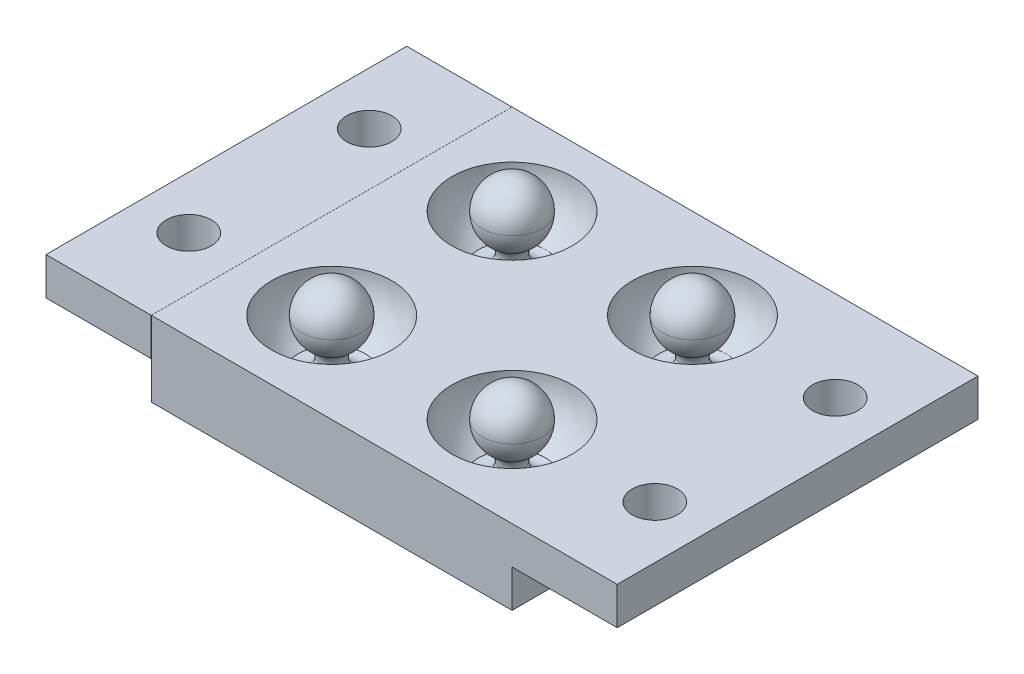
ISO-10303-21;
HEADER;
FILE_DESCRIPTION(('STEP AP214'),'2;1');
FILE_NAME('part.step','',(''),(''),'','','');
FILE_SCHEMA(('AUTOMOTIVE_DESIGN { 1 0 10303 214 1 1 1 1 }'));
ENDSEC;
DATA;
#1=APPLICATION_CONTEXT('core data for automotive mechanical design processes');
#2=APPLICATION_PROTOCOL_DEFINITION('international standard','automotive_design',2000,#1);
#3=PRODUCT_CONTEXT('',#1,'mechanical');
#4=PRODUCT('Part','Part','',(#3));
#5=PRODUCT_RELATED_PRODUCT_CATEGORY('part','',(#4));
#6=PRODUCT_DEFINITION_FORMATION('','',#4);
#7=PRODUCT_DEFINITION_CONTEXT('part definition',#1,'design');
#8=PRODUCT_DEFINITION('design','',#6,#7);
#9=PRODUCT_DEFINITION_SHAPE('','',#8);
#10=(LENGTH_UNIT() NAMED_UNIT(*) SI_UNIT(.MILLI.,.METRE.));
#11=(NAMED_UNIT(*) PLANE_ANGLE_UNIT() SI_UNIT($,.RADIAN.));
#12=(NAMED_UNIT(*) SI_UNIT($,.STERADIAN.) SOLID_ANGLE_UNIT());
#13=UNCERTAINTY_MEASURE_WITH_UNIT(LENGTH_MEASURE(1.E-05),#10,'distance_accuracy_value','');
#14=(GEOMETRIC_REPRESENTATION_CONTEXT(3) GLOBAL_UNCERTAINTY_ASSIGNED_CONTEXT((#13)) GLOBAL_UNIT_ASSIGNED_CONTEXT((#10,
#11,#12)) REPRESENTATION_CONTEXT('',''));
#15=CARTESIAN_POINT('',(0.,0.,0.));
#16=DIRECTION('',(0.,0.,1.));
#17=DIRECTION('',(1.,0.,0.));
#18=AXIS2_PLACEMENT_3D('',#15,#16,#17);
#19=CARTESIAN_POINT('',(-6.50216281890004,-1.25,0.));
#20=DIRECTION('',(1.,0.,0.));
#21=DIRECTION('',(0.,0.,-1.));
#22=AXIS2_PLACEMENT_3D('',#19,#20,#21);
#23=PLANE('',#22);
#24=DIRECTION('',(0.,0.,-1.));
#25=VECTOR('',#24,1.);
#26=CARTESIAN_POINT('',(-6.50216281890004,0.,0.));
#27=LINE('',#26,#25);
#28=CARTESIAN_POINT('',(-6.50216281890004,0.,9.00000000000001));
#29=VERTEX_POINT('',#28);
#30=CARTESIAN_POINT('',(-6.50216281890004,0.,-3.));
#31=VERTEX_POINT('',#30);
#32=EDGE_CURVE('E126',#29,#31,#27,.T.);
#33=ORIENTED_EDGE('',*,*,#32,.T.);
#34=DIRECTION('',(0.,1.,0.));
#35=VECTOR('',#34,1.);
#36=CARTESIAN_POINT('',(-6.50216281890004,-1.25,-3.));
#37=LINE('',#36,#35);
#38=CARTESIAN_POINT('',(-6.50216281890004,-1.25,-3.));
#39=VERTEX_POINT('',#38);
#40=EDGE_CURVE('E12',#39,#31,#37,.T.);
#41=ORIENTED_EDGE('',*,*,#40,.F.);
#42=DIRECTION('',(0.,0.,-1.));
#43=VECTOR('',#42,1.);
#44=CARTESIAN_POINT('',(-6.50216281890004,-1.25,0.));
#45=LINE('',#44,#43);
#46=CARTESIAN_POINT('',(-6.50216281890004,-1.25,9.00000000000001));
#47=VERTEX_POINT('',#46);
#48=EDGE_CURVE('E114',#47,#39,#45,.T.);
#49=ORIENTED_EDGE('',*,*,#48,.F.);
#50=DIRECTION('',(0.,1.,0.));
#51=VECTOR('',#50,1.);
#52=CARTESIAN_POINT('',(-6.50216281890004,-1.25,9.00000000000001));
#53=LINE('',#52,#51);
#54=EDGE_CURVE('E57',#47,#29,#53,.T.);
#55=ORIENTED_EDGE('',*,*,#54,.T.);
#56=EDGE_LOOP('',(#33,#41,#49,#55));
#57=FACE_BOUND('',#56,.T.);
#58=ADVANCED_FACE('F54',(#57),#23,.F.);
#59=CARTESIAN_POINT('',(0.,-1.25,-3.));
#60=DIRECTION('',(0.,0.,1.));
#61=DIRECTION('',(1.,0.,0.));
#62=AXIS2_PLACEMENT_3D('',#59,#60,#61);
#63=PLANE('',#62);
#64=DIRECTION('',(1.,0.,0.));
#65=VECTOR('',#64,1.);
#66=CARTESIAN_POINT('',(0.,0.,-3.));
#67=LINE('',#66,#65);
#68=CARTESIAN_POINT('',(-3.00216281890003,0.,-3.));
#69=VERTEX_POINT('',#68);
#70=EDGE_CURVE('E85',#31,#69,#67,.T.);
#71=ORIENTED_EDGE('',*,*,#70,.T.);
#72=DIRECTION('',(0.,1.,0.));
#73=VECTOR('',#72,1.);
#74=CARTESIAN_POINT('',(-3.00216281890003,-1.25,-3.));
#75=LINE('',#74,#73);
#76=CARTESIAN_POINT('',(-3.00216281890003,-1.25,-3.));
#77=VERTEX_POINT('',#76);
#78=EDGE_CURVE('E63',#77,#69,#75,.T.);
#79=ORIENTED_EDGE('',*,*,#78,.F.);
#80=DIRECTION('',(1.,0.,0.));
#81=VECTOR('',#80,1.);
#82=CARTESIAN_POINT('',(0.,-1.25,-3.));
#83=LINE('',#82,#81);
#84=EDGE_CURVE('E71',#39,#77,#83,.T.);
#85=ORIENTED_EDGE('',*,*,#84,.F.);
#86=ORIENTED_EDGE('',*,*,#40,.T.);
#87=EDGE_LOOP('',(#71,#79,#85,#86));
#88=FACE_BOUND('',#87,.T.);
#89=ADVANCED_FACE('F142',(#88),#63,.F.);
#90=CARTESIAN_POINT('',(-3.00216281890003,-1.25,0.));
#91=DIRECTION('',(-1.,0.,0.));
#92=DIRECTION('',(0.,0.,1.));
#93=AXIS2_PLACEMENT_3D('',#90,#91,#92);
#94=PLANE('',#93);
#95=DIRECTION('',(0.,0.,1.));
#96=VECTOR('',#95,1.);
#97=CARTESIAN_POINT('',(-3.00216281890003,0.,0.));
#98=LINE('',#97,#96);
#99=CARTESIAN_POINT('',(-3.00216281890003,0.,9.00000000000001));
#100=VERTEX_POINT('',#99);
#101=EDGE_CURVE('E111',#69,#100,#98,.T.);
#102=ORIENTED_EDGE('',*,*,#101,.T.);
#103=DIRECTION('',(0.,1.,0.));
#104=VECTOR('',#103,1.);
#105=CARTESIAN_POINT('',(-3.00216281890003,-1.25,9.00000000000001));
#106=LINE('',#105,#104);
#107=CARTESIAN_POINT('',(-3.00216281890003,-1.25,9.00000000000001));
#108=VERTEX_POINT('',#107);
#109=EDGE_CURVE('E109',#108,#100,#106,.T.);
#110=ORIENTED_EDGE('',*,*,#109,.F.);
#111=DIRECTION('',(0.,0.,1.));
#112=VECTOR('',#111,1.);
#113=CARTESIAN_POINT('',(-3.00216281890003,-1.25,0.));
#114=LINE('',#113,#112);
#115=EDGE_CURVE('E101',#77,#108,#114,.T.);
#116=ORIENTED_EDGE('',*,*,#115,.F.);
#117=ORIENTED_EDGE('',*,*,#78,.T.);
#118=EDGE_LOOP('',(#102,#110,#116,#117));
#119=FACE_BOUND('',#118,.T.);
#120=ADVANCED_FACE('F110',(#119),#94,.F.);
#121=CARTESIAN_POINT('',(-4.75216281890004,-1.25,6.));
#122=DIRECTION('',(0.,1.,0.));
#123=DIRECTION('',(0.,0.,1.));
#124=AXIS2_PLACEMENT_3D('',#121,#122,#123);
#125=CYLINDRICAL_SURFACE('',#124,0.75);
#126=CARTESIAN_POINT('',(-4.75216281890004,-1.25,6.));
#127=DIRECTION('',(0.,1.,0.));
#128=DIRECTION('',(0.,0.,1.));
#129=AXIS2_PLACEMENT_3D('',#126,#127,#128);
#130=CIRCLE('',#129,0.75);
#131=CARTESIAN_POINT('',(-4.75216281890004,-1.25,6.75));
#132=VERTEX_POINT('',#131);
#133=EDGE_CURVE('E120',#132,#132,#130,.F.);
#134=ORIENTED_EDGE('',*,*,#133,.T.);
#135=EDGE_LOOP('',(#134));
#136=FACE_BOUND('',#135,.T.);
#137=CARTESIAN_POINT('',(-4.75216281890004,0.,6.));
#138=DIRECTION('',(0.,1.,0.));
#139=DIRECTION('',(0.,0.,1.));
#140=AXIS2_PLACEMENT_3D('',#137,#138,#139);
#141=CIRCLE('',#140,0.75);
#142=CARTESIAN_POINT('',(-4.75216281890004,0.,6.75));
#143=VERTEX_POINT('',#142);
#144=EDGE_CURVE('E133',#143,#143,#141,.F.);
#145=ORIENTED_EDGE('',*,*,#144,.F.);
#146=EDGE_LOOP('',(#145));
#147=FACE_BOUND('',#146,.T.);
#148=ADVANCED_FACE('F149',(#136,#147),#125,.F.);
#149=CARTESIAN_POINT('',(0.,-1.25,9.00000000000001));
#150=DIRECTION('',(0.,0.,1.));
#151=DIRECTION('',(1.,0.,0.));
#152=AXIS2_PLACEMENT_3D('',#149,#150,#151);
#153=PLANE('',#152);
#154=DIRECTION('',(1.,0.,0.));
#155=VECTOR('',#154,1.);
#156=CARTESIAN_POINT('',(0.,0.,9.00000000000001));
#157=LINE('',#156,#155);
#158=EDGE_CURVE('E129',#29,#100,#157,.T.);
#159=ORIENTED_EDGE('',*,*,#158,.F.);
#160=ORIENTED_EDGE('',*,*,#54,.F.);
#161=DIRECTION('',(1.,0.,0.));
#162=VECTOR('',#161,1.);
#163=CARTESIAN_POINT('',(0.,-1.25,9.00000000000001));
#164=LINE('',#163,#162);
#165=EDGE_CURVE('E105',#47,#108,#164,.T.);
#166=ORIENTED_EDGE('',*,*,#165,.T.);
#167=ORIENTED_EDGE('',*,*,#109,.T.);
#168=EDGE_LOOP('',(#159,#160,#166,#167));
#169=FACE_BOUND('',#168,.T.);
#170=ADVANCED_FACE('F113',(#169),#153,.T.);
#171=CARTESIAN_POINT('',(-4.75216281890004,-1.25,0.));
#172=DIRECTION('',(0.,1.,0.));
#173=DIRECTION('',(0.,0.,1.));
#174=AXIS2_PLACEMENT_3D('',#171,#172,#173);
#175=CYLINDRICAL_SURFACE('',#174,0.75);
#176=CARTESIAN_POINT('',(-4.75216281890004,-1.25,0.));
#177=DIRECTION('',(0.,1.,0.));
#178=DIRECTION('',(0.,0.,1.));
#179=AXIS2_PLACEMENT_3D('',#176,#177,#178);
#180=CIRCLE('',#179,0.75);
#181=CARTESIAN_POINT('',(-4.75216281890004,-1.25,0.75));
#182=VERTEX_POINT('',#181);
#183=EDGE_CURVE('E123',#182,#182,#180,.T.);
#184=ORIENTED_EDGE('',*,*,#183,.F.);
#185=EDGE_LOOP('',(#184));
#186=FACE_BOUND('',#185,.T.);
#187=CARTESIAN_POINT('',(-4.75216281890004,0.,0.));
#188=DIRECTION('',(0.,1.,0.));
#189=DIRECTION('',(0.,0.,1.));
#190=AXIS2_PLACEMENT_3D('',#187,#188,#189);
#191=CIRCLE('',#190,0.75);
#192=CARTESIAN_POINT('',(-4.75216281890004,0.,0.75));
#193=VERTEX_POINT('',#192);
#194=EDGE_CURVE('E116',#193,#193,#191,.T.);
#195=ORIENTED_EDGE('',*,*,#194,.T.);
#196=EDGE_LOOP('',(#195));
#197=FACE_BOUND('',#196,.T.);
#198=ADVANCED_FACE('F154',(#186,#197),#175,.F.);
#199=CARTESIAN_POINT('',(0.,-1.25,0.));
#200=DIRECTION('',(0.,1.,0.));
#201=DIRECTION('',(0.,0.,1.));
#202=AXIS2_PLACEMENT_3D('',#199,#200,#201);
#203=PLANE('',#202);
#204=ORIENTED_EDGE('',*,*,#48,.T.);
#205=ORIENTED_EDGE('',*,*,#84,.T.);
#206=ORIENTED_EDGE('',*,*,#115,.T.);
#207=ORIENTED_EDGE('',*,*,#165,.F.);
#208=EDGE_LOOP('',(#204,#205,#206,#207));
#209=FACE_BOUND('',#208,.T.);
#210=ORIENTED_EDGE('',*,*,#133,.F.);
#211=EDGE_LOOP('',(#210));
#212=FACE_BOUND('',#211,.T.);
#213=ORIENTED_EDGE('',*,*,#183,.T.);
#214=EDGE_LOOP('',(#213));
#215=FACE_BOUND('',#214,.T.);
#216=ADVANCED_FACE('F103',(#209,#212,#215),#203,.F.);
#217=CARTESIAN_POINT('',(0.,0.,0.));
#218=DIRECTION('',(0.,1.,0.));
#219=DIRECTION('',(0.,0.,1.));
#220=AXIS2_PLACEMENT_3D('',#217,#218,#219);
#221=PLANE('',#220);
#222=ORIENTED_EDGE('',*,*,#32,.F.);
#223=ORIENTED_EDGE('',*,*,#158,.T.);
#224=ORIENTED_EDGE('',*,*,#101,.F.);
#225=ORIENTED_EDGE('',*,*,#70,.F.);
#226=EDGE_LOOP('',(#222,#223,#224,#225));
#227=FACE_BOUND('',#226,.T.);
#228=ORIENTED_EDGE('',*,*,#144,.T.);
#229=EDGE_LOOP('',(#228));
#230=FACE_BOUND('',#229,.T.);
#231=ORIENTED_EDGE('',*,*,#194,.F.);
#232=EDGE_LOOP('',(#231));
#233=FACE_BOUND('',#232,.T.);
#234=ADVANCED_FACE('F138',(#227,#230,#233),#221,.T.);
#235=CLOSED_SHELL('',(#58,#89,#120,#148,#170,#198,#216,#234));
#236=MANIFOLD_SOLID_BREP('B2',#235);
#237=CARTESIAN_POINT('',(0.,-2.5,0.));
#238=DIRECTION('',(0.,-1.,0.));
#239=DIRECTION('',(0.,0.,-1.));
#240=AXIS2_PLACEMENT_3D('',#237,#238,#239);
#241=PLANE('',#240);
#242=DIRECTION('',(1.,0.,0.));
#243=VECTOR('',#242,1.);
#244=CARTESIAN_POINT('',(0.,-2.5,-2.));
#245=LINE('',#244,#243);
#246=CARTESIAN_POINT('',(-2.,-2.5,-2.));
#247=VERTEX_POINT('',#246);
#248=CARTESIAN_POINT('',(8.,-2.5,-2.));
#249=VERTEX_POINT('',#248);
#250=EDGE_CURVE('E360',#247,#249,#245,.T.);
#251=ORIENTED_EDGE('',*,*,#250,.F.);
#252=DIRECTION('',(0.,0.,-1.));
#253=VECTOR('',#252,1.);
#254=CARTESIAN_POINT('',(-2.,-2.5,0.));
#255=LINE('',#254,#253);
#256=CARTESIAN_POINT('',(-2.,-2.5,8.));
#257=VERTEX_POINT('',#256);
#258=EDGE_CURVE('E357',#257,#247,#255,.T.);
#259=ORIENTED_EDGE('',*,*,#258,.F.);
#260=DIRECTION('',(1.,0.,0.));
#261=VECTOR('',#260,1.);
#262=CARTESIAN_POINT('',(-3.,-2.5,8.));
#263=LINE('',#262,#261);
#264=CARTESIAN_POINT('',(8.,-2.5,8.));
#265=VERTEX_POINT('',#264);
#266=EDGE_CURVE('E246',#257,#265,#263,.T.);
#267=ORIENTED_EDGE('',*,*,#266,.T.);
#268=DIRECTION('',(0.,0.,-1.));
#269=VECTOR('',#268,1.);
#270=CARTESIAN_POINT('',(8.,-2.5,3.));
#271=LINE('',#270,#269);
#272=EDGE_CURVE('E370',#265,#249,#271,.T.);
#273=ORIENTED_EDGE('',*,*,#272,.T.);
#274=EDGE_LOOP('',(#251,#259,#267,#273));
#275=FACE_BOUND('',#274,.T.);
#276=DIRECTION('',(1.,0.,0.));
#277=VECTOR('',#276,1.);
#278=CARTESIAN_POINT('',(-3.,-2.5,-3.));
#279=LINE('',#278,#277);
#280=CARTESIAN_POINT('',(-3.,-2.5,-3.));
#281=VERTEX_POINT('',#280);
#282=CARTESIAN_POINT('',(9.,-2.5,-3.));
#283=VERTEX_POINT('',#282);
#284=EDGE_CURVE('E527',#281,#283,#279,.T.);
#285=ORIENTED_EDGE('',*,*,#284,.T.);
#286=DIRECTION('',(0.,0.,-1.));
#287=VECTOR('',#286,1.);
#288=CARTESIAN_POINT('',(9.,-2.5,3.));
#289=LINE('',#288,#287);
#290=CARTESIAN_POINT('',(9.,-2.5,9.));
#291=VERTEX_POINT('',#290);
#292=EDGE_CURVE('E476',#291,#283,#289,.T.);
#293=ORIENTED_EDGE('',*,*,#292,.F.);
#294=DIRECTION('',(1.,0.,0.));
#295=VECTOR('',#294,1.);
#296=CARTESIAN_POINT('',(-3.,-2.5,9.00000000000001));
#297=LINE('',#296,#295);
#298=CARTESIAN_POINT('',(-3.,-2.5,9.00000000000001));
#299=VERTEX_POINT('',#298);
#300=EDGE_CURVE('E455',#299,#291,#297,.T.);
#301=ORIENTED_EDGE('',*,*,#300,.F.);
#302=DIRECTION('',(0.,0.,-1.));
#303=VECTOR('',#302,1.);
#304=CARTESIAN_POINT('',(-3.,-2.5,3.));
#305=LINE('',#304,#303);
#306=EDGE_CURVE('E502',#299,#281,#305,.T.);
#307=ORIENTED_EDGE('',*,*,#306,.T.);
#308=EDGE_LOOP('',(#285,#293,#301,#307));
#309=FACE_BOUND('',#308,.T.);
#310=ADVANCED_FACE('F228',(#275,#309),#241,.T.);
#311=CARTESIAN_POINT('',(-3.,3.,3.));
#312=DIRECTION('',(-1.,0.,0.));
#313=DIRECTION('',(0.,0.,1.));
#314=AXIS2_PLACEMENT_3D('',#311,#312,#313);
#315=PLANE('',#314);
#316=ORIENTED_EDGE('',*,*,#306,.F.);
#317=DIRECTION('',(0.,-1.,0.));
#318=VECTOR('',#317,1.);
#319=CARTESIAN_POINT('',(-3.,3.,9.00000000000001));
#320=LINE('',#319,#318);
#321=CARTESIAN_POINT('',(-3.,0.,9.00000000000001));
#322=VERTEX_POINT('',#321);
#323=EDGE_CURVE('E480',#322,#299,#320,.T.);
#324=ORIENTED_EDGE('',*,*,#323,.F.);
#325=DIRECTION('',(0.,0.,-1.));
#326=VECTOR('',#325,1.);
#327=CARTESIAN_POINT('',(-3.,0.,3.));
#328=LINE('',#327,#326);
#329=CARTESIAN_POINT('',(-3.,0.,-3.));
#330=VERTEX_POINT('',#329);
#331=EDGE_CURVE('E522',#322,#330,#328,.T.);
#332=ORIENTED_EDGE('',*,*,#331,.T.);
#333=DIRECTION('',(0.,-1.,0.));
#334=VECTOR('',#333,1.);
#335=CARTESIAN_POINT('',(-3.,3.,-3.));
#336=LINE('',#335,#334);
#337=EDGE_CURVE('E232',#330,#281,#336,.T.);
#338=ORIENTED_EDGE('',*,*,#337,.T.);
#339=EDGE_LOOP('',(#316,#324,#332,#338));
#340=FACE_BOUND('',#339,.T.);
#341=ADVANCED_FACE('F230',(#340),#315,.T.);
#342=CARTESIAN_POINT('',(-3.,3.,-3.));
#343=DIRECTION('',(0.,0.,-1.));
#344=DIRECTION('',(-1.,0.,0.));
#345=AXIS2_PLACEMENT_3D('',#342,#343,#344);
#346=PLANE('',#345);
#347=ORIENTED_EDGE('',*,*,#337,.F.);
#348=DIRECTION('',(1.,0.,0.));
#349=VECTOR('',#348,1.);
#350=CARTESIAN_POINT('',(-3.,0.,-3.));
#351=LINE('',#350,#349);
#352=CARTESIAN_POINT('',(12.4978371811,0.,-3.));
#353=VERTEX_POINT('',#352);
#354=EDGE_CURVE('E518',#330,#353,#351,.T.);
#355=ORIENTED_EDGE('',*,*,#354,.T.);
#356=DIRECTION('',(0.,1.,0.));
#357=VECTOR('',#356,1.);
#358=CARTESIAN_POINT('',(12.4978371811,-1.25,-3.));
#359=LINE('',#358,#357);
#360=CARTESIAN_POINT('',(12.4978371811,-1.25,-3.));
#361=VERTEX_POINT('',#360);
#362=EDGE_CURVE('E433',#361,#353,#359,.T.);
#363=ORIENTED_EDGE('',*,*,#362,.F.);
#364=DIRECTION('',(-1.,0.,0.));
#365=VECTOR('',#364,1.);
#366=CARTESIAN_POINT('',(0.,-1.25,-3.));
#367=LINE('',#366,#365);
#368=CARTESIAN_POINT('',(9.,-1.25,-3.));
#369=VERTEX_POINT('',#368);
#370=EDGE_CURVE('E418',#361,#369,#367,.T.);
#371=ORIENTED_EDGE('',*,*,#370,.T.);
#372=DIRECTION('',(0.,-1.,0.));
#373=VECTOR('',#372,1.);
#374=CARTESIAN_POINT('',(9.,3.,-3.));
#375=LINE('',#374,#373);
#376=EDGE_CURVE('E498',#369,#283,#375,.T.);
#377=ORIENTED_EDGE('',*,*,#376,.T.);
#378=ORIENTED_EDGE('',*,*,#284,.F.);
#379=EDGE_LOOP('',(#347,#355,#363,#371,#377,#378));
#380=FACE_BOUND('',#379,.T.);
#381=ADVANCED_FACE('F537',(#380),#346,.T.);
#382=CARTESIAN_POINT('',(0.,0.,0.));
#383=DIRECTION('',(0.,-1.,0.));
#384=DIRECTION('',(-1.,0.,0.));
#385=AXIS2_PLACEMENT_3D('',#382,#383,#384);
#386=SPHERICAL_SURFACE('',#385,1.);
#387=CARTESIAN_POINT('',(0.,0.,0.));
#388=DIRECTION('',(0.,1.,0.));
#389=DIRECTION('',(0.,0.,1.));
#390=AXIS2_PLACEMENT_3D('',#387,#388,#389);
#391=CIRCLE('',#390,1.);
#392=CARTESIAN_POINT('',(0.,0.,1.));
#393=VERTEX_POINT('',#392);
#394=EDGE_CURVE('E516',#393,#393,#391,.T.);
#395=ORIENTED_EDGE('',*,*,#394,.T.);
#396=EDGE_LOOP('',(#395));
#397=FACE_BOUND('',#396,.T.);
#398=ADVANCED_FACE('F578',(#397),#386,.T.);
#399=CARTESIAN_POINT('',(0.,-0.866025403784438,0.));
#400=DIRECTION('',(0.,-1.,0.));
#401=DIRECTION('',(0.,0.,-1.));
#402=AXIS2_PLACEMENT_3D('',#399,#400,#401);
#403=CIRCLE('',#402,0.5);
#404=CARTESIAN_POINT('',(0.,-0.866025403784438,-0.5));
#405=VERTEX_POINT('',#404);
#406=EDGE_CURVE('E513',#405,#405,#403,.T.);
#407=ORIENTED_EDGE('',*,*,#406,.F.);
#408=EDGE_LOOP('',(#407));
#409=FACE_BOUND('',#408,.T.);
#410=ORIENTED_EDGE('',*,*,#394,.F.);
#411=EDGE_LOOP('',(#410));
#412=FACE_BOUND('',#411,.T.);
#413=ADVANCED_FACE('F582',(#409,#412),#386,.T.);
#414=CARTESIAN_POINT('',(0.,-1.18301270189222,0.));
#415=DIRECTION('',(0.,-1.,0.));
#416=DIRECTION('',(0.,0.,-1.));
#417=AXIS2_PLACEMENT_3D('',#414,#415,#416);
#418=TOROIDAL_SURFACE('',#417,0.911437827766148,0.519386208209842);
#419=CARTESIAN_POINT('',(0.,-1.18301270189222,0.));
#420=DIRECTION('',(0.,1.,0.));
#421=DIRECTION('',(0.,0.,1.));
#422=AXIS2_PLACEMENT_3D('',#419,#420,#421);
#423=CIRCLE('',#422,0.392051619556306);
#424=CARTESIAN_POINT('',(0.,-1.18301270189222,0.392051619556306));
#425=VERTEX_POINT('',#424);
#426=EDGE_CURVE('E510',#425,#425,#423,.T.);
#427=ORIENTED_EDGE('',*,*,#426,.T.);
#428=EDGE_LOOP('',(#427));
#429=FACE_BOUND('',#428,.T.);
#430=ORIENTED_EDGE('',*,*,#406,.T.);
#431=EDGE_LOOP('',(#430));
#432=FACE_BOUND('',#431,.T.);
#433=ADVANCED_FACE('F587',(#429,#432),#418,.F.);
#434=CARTESIAN_POINT('',(0.,-1.6616889514941,0.));
#435=DIRECTION('',(0.,-1.,0.));
#436=DIRECTION('',(0.,0.,-1.));
#437=AXIS2_PLACEMENT_3D('',#434,#435,#436);
#438=CIRCLE('',#437,1.11300935687102);
#439=CARTESIAN_POINT('',(0.,-1.6616889514941,-1.11300935687102));
#440=VERTEX_POINT('',#439);
#441=EDGE_CURVE('E238',#440,#440,#438,.T.);
#442=ORIENTED_EDGE('',*,*,#441,.F.);
#443=EDGE_LOOP('',(#442));
#444=FACE_BOUND('',#443,.T.);
#445=ORIENTED_EDGE('',*,*,#426,.F.);
#446=EDGE_LOOP('',(#445));
#447=FACE_BOUND('',#446,.T.);
#448=ADVANCED_FACE('F592',(#444,#447),#418,.F.);
#449=CARTESIAN_POINT('',(0.,0.,0.));
#450=DIRECTION('',(0.,-1.,0.));
#451=DIRECTION('',(-1.,0.,0.));
#452=AXIS2_PLACEMENT_3D('',#449,#450,#451);
#453=SPHERICAL_SURFACE('',#452,2.);
#454=ORIENTED_EDGE('',*,*,#441,.T.);
#455=EDGE_LOOP('',(#454));
#456=FACE_BOUND('',#455,.T.);
#457=CARTESIAN_POINT('',(0.,0.,0.));
#458=DIRECTION('',(0.,-1.,0.));
#459=DIRECTION('',(0.,0.,-1.));
#460=AXIS2_PLACEMENT_3D('',#457,#458,#459);
#461=CIRCLE('',#460,2.);
#462=CARTESIAN_POINT('',(0.,0.,-2.));
#463=VERTEX_POINT('',#462);
#464=EDGE_CURVE('E52',#463,#463,#461,.T.);
#465=ORIENTED_EDGE('',*,*,#464,.F.);
#466=EDGE_LOOP('',(#465));
#467=FACE_BOUND('',#466,.T.);
#468=ADVANCED_FACE('F594',(#456,#467),#453,.F.);
#469=CARTESIAN_POINT('',(-0.0744648600193827,0.,-2.));
#470=DIRECTION('',(0.,1.,0.));
#471=DIRECTION('',(1.,0.,0.));
#472=AXIS2_PLACEMENT_3D('',#469,#470,#471);
#473=PLANE('',#472);
#474=ORIENTED_EDGE('',*,*,#354,.F.);
#475=ORIENTED_EDGE('',*,*,#331,.F.);
#476=DIRECTION('',(1.,0.,0.));
#477=VECTOR('',#476,1.);
#478=CARTESIAN_POINT('',(-3.,0.,9.00000000000001));
#479=LINE('',#478,#477);
#480=CARTESIAN_POINT('',(12.4978371811,0.,9.00000000000001));
#481=VERTEX_POINT('',#480);
#482=EDGE_CURVE('E472',#322,#481,#479,.T.);
#483=ORIENTED_EDGE('',*,*,#482,.T.);
#484=DIRECTION('',(0.,0.,-1.));
#485=VECTOR('',#484,1.);
#486=CARTESIAN_POINT('',(12.4978371811,0.,0.));
#487=LINE('',#486,#485);
#488=EDGE_CURVE('E428',#481,#353,#487,.T.);
#489=ORIENTED_EDGE('',*,*,#488,.T.);
#490=EDGE_LOOP('',(#474,#475,#483,#489));
#491=FACE_BOUND('',#490,.T.);
#492=ORIENTED_EDGE('',*,*,#464,.T.);
#493=EDGE_LOOP('',(#492));
#494=FACE_BOUND('',#493,.T.);
#495=CARTESIAN_POINT('',(6.,0.,0.));
#496=DIRECTION('',(0.,1.,0.));
#497=DIRECTION('',(0.,0.,-1.));
#498=AXIS2_PLACEMENT_3D('',#495,#496,#497);
#499=CIRCLE('',#498,2.);
#500=CARTESIAN_POINT('',(6.,0.,-2.));
#501=VERTEX_POINT('',#500);
#502=EDGE_CURVE('E488',#501,#501,#499,.T.);
#503=ORIENTED_EDGE('',*,*,#502,.F.);
#504=EDGE_LOOP('',(#503));
#505=FACE_BOUND('',#504,.T.);
#506=CARTESIAN_POINT('',(0.,0.,6.));
#507=DIRECTION('',(0.,1.,0.));
#508=DIRECTION('',(0.,0.,1.));
#509=AXIS2_PLACEMENT_3D('',#506,#507,#508);
#510=CIRCLE('',#509,2.);
#511=CARTESIAN_POINT('',(0.,0.,8.));
#512=VERTEX_POINT('',#511);
#513=EDGE_CURVE('E462',#512,#512,#510,.T.);
#514=ORIENTED_EDGE('',*,*,#513,.F.);
#515=EDGE_LOOP('',(#514));
#516=FACE_BOUND('',#515,.T.);
#517=CARTESIAN_POINT('',(6.,0.,6.));
#518=DIRECTION('',(0.,-1.,0.));
#519=DIRECTION('',(0.,0.,1.));
#520=AXIS2_PLACEMENT_3D('',#517,#518,#519);
#521=CIRCLE('',#520,2.);
#522=CARTESIAN_POINT('',(6.,0.,8.));
#523=VERTEX_POINT('',#522);
#524=EDGE_CURVE('E442',#523,#523,#521,.T.);
#525=ORIENTED_EDGE('',*,*,#524,.T.);
#526=EDGE_LOOP('',(#525));
#527=FACE_BOUND('',#526,.T.);
#528=CARTESIAN_POINT('',(10.7478371811,0.,6.));
#529=DIRECTION('',(0.,1.,0.));
#530=DIRECTION('',(0.,0.,1.));
#531=AXIS2_PLACEMENT_3D('',#528,#529,#530);
#532=CIRCLE('',#531,0.75);
#533=CARTESIAN_POINT('',(10.7478371811,0.,6.75));
#534=VERTEX_POINT('',#533);
#535=EDGE_CURVE('E407',#534,#534,#532,.T.);
#536=ORIENTED_EDGE('',*,*,#535,.F.);
#537=EDGE_LOOP('',(#536));
#538=FACE_BOUND('',#537,.T.);
#539=CARTESIAN_POINT('',(10.7478371811,0.,0.));
#540=DIRECTION('',(0.,1.,0.));
#541=DIRECTION('',(0.,0.,1.));
#542=AXIS2_PLACEMENT_3D('',#539,#540,#541);
#543=CIRCLE('',#542,0.75);
#544=CARTESIAN_POINT('',(10.7478371811,0.,0.75));
#545=VERTEX_POINT('',#544);
#546=EDGE_CURVE('E412',#545,#545,#543,.F.);
#547=ORIENTED_EDGE('',*,*,#546,.T.);
#548=EDGE_LOOP('',(#547));
#549=FACE_BOUND('',#548,.T.);
#550=ADVANCED_FACE('F550',(#491,#494,#505,#516,#527,#538,#549),#473,.T.);
#551=CARTESIAN_POINT('',(9.,3.,3.));
#552=DIRECTION('',(1.,0.,0.));
#553=DIRECTION('',(0.,0.,1.));
#554=AXIS2_PLACEMENT_3D('',#551,#552,#553);
#555=PLANE('',#554);
#556=DIRECTION('',(0.,0.,-1.));
#557=VECTOR('',#556,1.);
#558=CARTESIAN_POINT('',(9.,-1.25,0.));
#559=LINE('',#558,#557);
#560=CARTESIAN_POINT('',(9.,-1.25,9.));
#561=VERTEX_POINT('',#560);
#562=EDGE_CURVE('E254',#561,#369,#559,.T.);
#563=ORIENTED_EDGE('',*,*,#562,.F.);
#564=DIRECTION('',(0.,-1.,0.));
#565=VECTOR('',#564,1.);
#566=CARTESIAN_POINT('',(9.,3.,9.));
#567=LINE('',#566,#565);
#568=EDGE_CURVE('E436',#561,#291,#567,.T.);
#569=ORIENTED_EDGE('',*,*,#568,.T.);
#570=ORIENTED_EDGE('',*,*,#292,.T.);
#571=ORIENTED_EDGE('',*,*,#376,.F.);
#572=EDGE_LOOP('',(#563,#569,#570,#571));
#573=FACE_BOUND('',#572,.T.);
#574=ADVANCED_FACE('F539',(#573),#555,.T.);
#575=CARTESIAN_POINT('',(6.,0.,0.));
#576=DIRECTION('',(0.,-1.,0.));
#577=DIRECTION('',(1.,0.,0.));
#578=AXIS2_PLACEMENT_3D('',#575,#576,#577);
#579=SPHERICAL_SURFACE('',#578,1.);
#580=CARTESIAN_POINT('',(6.,0.,0.));
#581=DIRECTION('',(0.,-1.,0.));
#582=DIRECTION('',(0.,0.,1.));
#583=AXIS2_PLACEMENT_3D('',#580,#581,#582);
#584=CIRCLE('',#583,1.);
#585=CARTESIAN_POINT('',(6.,0.,1.));
#586=VERTEX_POINT('',#585);
#587=EDGE_CURVE('E495',#586,#586,#584,.T.);
#588=ORIENTED_EDGE('',*,*,#587,.F.);
#589=EDGE_LOOP('',(#588));
#590=FACE_BOUND('',#589,.T.);
#591=ADVANCED_FACE('F600',(#590),#579,.T.);
#592=CARTESIAN_POINT('',(6.,-0.866025403784438,0.));
#593=DIRECTION('',(0.,1.,0.));
#594=DIRECTION('',(0.,0.,-1.));
#595=AXIS2_PLACEMENT_3D('',#592,#593,#594);
#596=CIRCLE('',#595,0.5);
#597=CARTESIAN_POINT('',(6.,-0.866025403784438,-0.499999999999999));
#598=VERTEX_POINT('',#597);
#599=EDGE_CURVE('E492',#598,#598,#596,.T.);
#600=ORIENTED_EDGE('',*,*,#599,.T.);
#601=EDGE_LOOP('',(#600));
#602=FACE_BOUND('',#601,.T.);
#603=ORIENTED_EDGE('',*,*,#587,.T.);
#604=EDGE_LOOP('',(#603));
#605=FACE_BOUND('',#604,.T.);
#606=ADVANCED_FACE('F601',(#602,#605),#579,.T.);
#607=CARTESIAN_POINT('',(6.,-1.18301270189222,0.));
#608=DIRECTION('',(0.,-1.,0.));
#609=DIRECTION('',(0.,0.,-1.));
#610=AXIS2_PLACEMENT_3D('',#607,#608,#609);
#611=TOROIDAL_SURFACE('',#610,0.911437827766148,0.519386208209842);
#612=CARTESIAN_POINT('',(6.,-1.18301270189222,0.));
#613=DIRECTION('',(0.,-1.,0.));
#614=DIRECTION('',(0.,0.,1.));
#615=AXIS2_PLACEMENT_3D('',#612,#613,#614);
#616=CIRCLE('',#615,0.392051619556306);
#617=CARTESIAN_POINT('',(6.,-1.18301270189222,0.392051619556307));
#618=VERTEX_POINT('',#617);
#619=EDGE_CURVE('E489',#618,#618,#616,.T.);
#620=ORIENTED_EDGE('',*,*,#619,.F.);
#621=EDGE_LOOP('',(#620));
#622=FACE_BOUND('',#621,.T.);
#623=ORIENTED_EDGE('',*,*,#599,.F.);
#624=EDGE_LOOP('',(#623));
#625=FACE_BOUND('',#624,.T.);
#626=ADVANCED_FACE('F604',(#622,#625),#611,.F.);
#627=CARTESIAN_POINT('',(6.,-1.6616889514941,0.));
#628=DIRECTION('',(0.,1.,0.));
#629=DIRECTION('',(0.,0.,-1.));
#630=AXIS2_PLACEMENT_3D('',#627,#628,#629);
#631=CIRCLE('',#630,1.11300935687102);
#632=CARTESIAN_POINT('',(6.,-1.6616889514941,-1.11300935687102));
#633=VERTEX_POINT('',#632);
#634=EDGE_CURVE('E485',#633,#633,#631,.T.);
#635=ORIENTED_EDGE('',*,*,#634,.T.);
#636=EDGE_LOOP('',(#635));
#637=FACE_BOUND('',#636,.T.);
#638=ORIENTED_EDGE('',*,*,#619,.T.);
#639=EDGE_LOOP('',(#638));
#640=FACE_BOUND('',#639,.T.);
#641=ADVANCED_FACE('F608',(#637,#640),#611,.F.);
#642=CARTESIAN_POINT('',(6.,0.,0.));
#643=DIRECTION('',(0.,-1.,0.));
#644=DIRECTION('',(1.,0.,0.));
#645=AXIS2_PLACEMENT_3D('',#642,#643,#644);
#646=SPHERICAL_SURFACE('',#645,2.);
#647=ORIENTED_EDGE('',*,*,#634,.F.);
#648=EDGE_LOOP('',(#647));
#649=FACE_BOUND('',#648,.T.);
#650=ORIENTED_EDGE('',*,*,#502,.T.);
#651=EDGE_LOOP('',(#650));
#652=FACE_BOUND('',#651,.T.);
#653=ADVANCED_FACE('F610',(#649,#652),#646,.F.);
#654=CARTESIAN_POINT('',(-3.,3.,9.00000000000001));
#655=DIRECTION('',(0.,0.,1.));
#656=DIRECTION('',(-1.,0.,0.));
#657=AXIS2_PLACEMENT_3D('',#654,#655,#656);
#658=PLANE('',#657);
#659=ORIENTED_EDGE('',*,*,#323,.T.);
#660=ORIENTED_EDGE('',*,*,#300,.T.);
#661=ORIENTED_EDGE('',*,*,#568,.F.);
#662=DIRECTION('',(-1.,0.,0.));
#663=VECTOR('',#662,1.);
#664=CARTESIAN_POINT('',(0.,-1.25,9.00000000000001));
#665=LINE('',#664,#663);
#666=CARTESIAN_POINT('',(12.4978371811,-1.25,9.00000000000001));
#667=VERTEX_POINT('',#666);
#668=EDGE_CURVE('E411',#667,#561,#665,.T.);
#669=ORIENTED_EDGE('',*,*,#668,.F.);
#670=DIRECTION('',(0.,1.,0.));
#671=VECTOR('',#670,1.);
#672=CARTESIAN_POINT('',(12.4978371811,-1.25,9.00000000000001));
#673=LINE('',#672,#671);
#674=EDGE_CURVE('E425',#667,#481,#673,.T.);
#675=ORIENTED_EDGE('',*,*,#674,.T.);
#676=ORIENTED_EDGE('',*,*,#482,.F.);
#677=EDGE_LOOP('',(#659,#660,#661,#669,#675,#676));
#678=FACE_BOUND('',#677,.T.);
#679=ADVANCED_FACE('F546',(#678),#658,.T.);
#680=CARTESIAN_POINT('',(0.,0.,6.));
#681=DIRECTION('',(0.,-1.,0.));
#682=DIRECTION('',(-1.,0.,0.));
#683=AXIS2_PLACEMENT_3D('',#680,#681,#682);
#684=SPHERICAL_SURFACE('',#683,1.);
#685=CARTESIAN_POINT('',(0.,0.,6.));
#686=DIRECTION('',(0.,-1.,0.));
#687=DIRECTION('',(0.,0.,-1.));
#688=AXIS2_PLACEMENT_3D('',#685,#686,#687);
#689=CIRCLE('',#688,1.);
#690=CARTESIAN_POINT('',(0.,0.,5.));
#691=VERTEX_POINT('',#690);
#692=EDGE_CURVE('E469',#691,#691,#689,.T.);
#693=ORIENTED_EDGE('',*,*,#692,.F.);
#694=EDGE_LOOP('',(#693));
#695=FACE_BOUND('',#694,.T.);
#696=ADVANCED_FACE('F616',(#695),#684,.T.);
#697=CARTESIAN_POINT('',(0.,-0.866025403784438,6.));
#698=DIRECTION('',(0.,1.,0.));
#699=DIRECTION('',(0.,0.,1.));
#700=AXIS2_PLACEMENT_3D('',#697,#698,#699);
#701=CIRCLE('',#700,0.5);
#702=CARTESIAN_POINT('',(0.,-0.866025403784438,6.5));
#703=VERTEX_POINT('',#702);
#704=EDGE_CURVE('E466',#703,#703,#701,.T.);
#705=ORIENTED_EDGE('',*,*,#704,.T.);
#706=EDGE_LOOP('',(#705));
#707=FACE_BOUND('',#706,.T.);
#708=ORIENTED_EDGE('',*,*,#692,.T.);
#709=EDGE_LOOP('',(#708));
#710=FACE_BOUND('',#709,.T.);
#711=ADVANCED_FACE('F617',(#707,#710),#684,.T.);
#712=CARTESIAN_POINT('',(0.,-1.18301270189222,6.));
#713=DIRECTION('',(0.,-1.,0.));
#714=DIRECTION('',(0.,0.,1.));
#715=AXIS2_PLACEMENT_3D('',#712,#713,#714);
#716=TOROIDAL_SURFACE('',#715,0.911437827766148,0.519386208209842);
#717=CARTESIAN_POINT('',(0.,-1.18301270189222,6.));
#718=DIRECTION('',(0.,-1.,0.));
#719=DIRECTION('',(0.,0.,-1.));
#720=AXIS2_PLACEMENT_3D('',#717,#718,#719);
#721=CIRCLE('',#720,0.392051619556306);
#722=CARTESIAN_POINT('',(0.,-1.18301270189222,5.6079483804437));
#723=VERTEX_POINT('',#722);
#724=EDGE_CURVE('E463',#723,#723,#721,.T.);
#725=ORIENTED_EDGE('',*,*,#724,.F.);
#726=EDGE_LOOP('',(#725));
#727=FACE_BOUND('',#726,.T.);
#728=ORIENTED_EDGE('',*,*,#704,.F.);
#729=EDGE_LOOP('',(#728));
#730=FACE_BOUND('',#729,.T.);
#731=ADVANCED_FACE('F620',(#727,#730),#716,.F.);
#732=CARTESIAN_POINT('',(0.,-1.6616889514941,6.));
#733=DIRECTION('',(0.,1.,0.));
#734=DIRECTION('',(0.,0.,1.));
#735=AXIS2_PLACEMENT_3D('',#732,#733,#734);
#736=CIRCLE('',#735,1.11300935687102);
#737=CARTESIAN_POINT('',(0.,-1.6616889514941,7.11300935687103));
#738=VERTEX_POINT('',#737);
#739=EDGE_CURVE('E459',#738,#738,#736,.T.);
#740=ORIENTED_EDGE('',*,*,#739,.T.);
#741=EDGE_LOOP('',(#740));
#742=FACE_BOUND('',#741,.T.);
#743=ORIENTED_EDGE('',*,*,#724,.T.);
#744=EDGE_LOOP('',(#743));
#745=FACE_BOUND('',#744,.T.);
#746=ADVANCED_FACE('F624',(#742,#745),#716,.F.);
#747=CARTESIAN_POINT('',(0.,0.,6.));
#748=DIRECTION('',(0.,-1.,0.));
#749=DIRECTION('',(-1.,0.,0.));
#750=AXIS2_PLACEMENT_3D('',#747,#748,#749);
#751=SPHERICAL_SURFACE('',#750,2.);
#752=ORIENTED_EDGE('',*,*,#739,.F.);
#753=EDGE_LOOP('',(#752));
#754=FACE_BOUND('',#753,.T.);
#755=ORIENTED_EDGE('',*,*,#513,.T.);
#756=EDGE_LOOP('',(#755));
#757=FACE_BOUND('',#756,.T.);
#758=ADVANCED_FACE('F626',(#754,#757),#751,.F.);
#759=CARTESIAN_POINT('',(6.,0.,6.));
#760=DIRECTION('',(0.,-1.,0.));
#761=DIRECTION('',(1.,0.,0.));
#762=AXIS2_PLACEMENT_3D('',#759,#760,#761);
#763=SPHERICAL_SURFACE('',#762,1.);
#764=CARTESIAN_POINT('',(6.,0.,6.));
#765=DIRECTION('',(0.,1.,0.));
#766=DIRECTION('',(0.,0.,-1.));
#767=AXIS2_PLACEMENT_3D('',#764,#765,#766);
#768=CIRCLE('',#767,1.);
#769=CARTESIAN_POINT('',(6.,0.,5.));
#770=VERTEX_POINT('',#769);
#771=EDGE_CURVE('E449',#770,#770,#768,.T.);
#772=ORIENTED_EDGE('',*,*,#771,.T.);
#773=EDGE_LOOP('',(#772));
#774=FACE_BOUND('',#773,.T.);
#775=ADVANCED_FACE('F629',(#774),#763,.T.);
#776=CARTESIAN_POINT('',(6.,-0.866025403784438,6.));
#777=DIRECTION('',(0.,-1.,0.));
#778=DIRECTION('',(0.,0.,1.));
#779=AXIS2_PLACEMENT_3D('',#776,#777,#778);
#780=CIRCLE('',#779,0.5);
#781=CARTESIAN_POINT('',(6.,-0.866025403784438,6.5));
#782=VERTEX_POINT('',#781);
#783=EDGE_CURVE('E446',#782,#782,#780,.T.);
#784=ORIENTED_EDGE('',*,*,#783,.F.);
#785=EDGE_LOOP('',(#784));
#786=FACE_BOUND('',#785,.T.);
#787=ORIENTED_EDGE('',*,*,#771,.F.);
#788=EDGE_LOOP('',(#787));
#789=FACE_BOUND('',#788,.T.);
#790=ADVANCED_FACE('F631',(#786,#789),#763,.T.);
#791=CARTESIAN_POINT('',(6.,-1.18301270189222,6.));
#792=DIRECTION('',(0.,-1.,0.));
#793=DIRECTION('',(0.,0.,1.));
#794=AXIS2_PLACEMENT_3D('',#791,#792,#793);
#795=TOROIDAL_SURFACE('',#794,0.911437827766148,0.519386208209842);
#796=CARTESIAN_POINT('',(6.,-1.18301270189222,6.));
#797=DIRECTION('',(0.,1.,0.));
#798=DIRECTION('',(0.,0.,-1.));
#799=AXIS2_PLACEMENT_3D('',#796,#797,#798);
#800=CIRCLE('',#799,0.392051619556306);
#801=CARTESIAN_POINT('',(6.,-1.18301270189222,5.6079483804437));
#802=VERTEX_POINT('',#801);
#803=EDGE_CURVE('E443',#802,#802,#800,.T.);
#804=ORIENTED_EDGE('',*,*,#803,.T.);
#805=EDGE_LOOP('',(#804));
#806=FACE_BOUND('',#805,.T.);
#807=ORIENTED_EDGE('',*,*,#783,.T.);
#808=EDGE_LOOP('',(#807));
#809=FACE_BOUND('',#808,.T.);
#810=ADVANCED_FACE('F634',(#806,#809),#795,.F.);
#811=CARTESIAN_POINT('',(6.,-1.6616889514941,6.));
#812=DIRECTION('',(0.,-1.,0.));
#813=DIRECTION('',(0.,0.,1.));
#814=AXIS2_PLACEMENT_3D('',#811,#812,#813);
#815=CIRCLE('',#814,1.11300935687102);
#816=CARTESIAN_POINT('',(6.,-1.6616889514941,7.11300935687102));
#817=VERTEX_POINT('',#816);
#818=EDGE_CURVE('E439',#817,#817,#815,.T.);
#819=ORIENTED_EDGE('',*,*,#818,.F.);
#820=EDGE_LOOP('',(#819));
#821=FACE_BOUND('',#820,.T.);
#822=ORIENTED_EDGE('',*,*,#803,.F.);
#823=EDGE_LOOP('',(#822));
#824=FACE_BOUND('',#823,.T.);
#825=ADVANCED_FACE('F565',(#821,#824),#795,.F.);
#826=CARTESIAN_POINT('',(6.,0.,6.));
#827=DIRECTION('',(0.,-1.,0.));
#828=DIRECTION('',(1.,0.,0.));
#829=AXIS2_PLACEMENT_3D('',#826,#827,#828);
#830=SPHERICAL_SURFACE('',#829,2.);
#831=ORIENTED_EDGE('',*,*,#818,.T.);
#832=EDGE_LOOP('',(#831));
#833=FACE_BOUND('',#832,.T.);
#834=ORIENTED_EDGE('',*,*,#524,.F.);
#835=EDGE_LOOP('',(#834));
#836=FACE_BOUND('',#835,.T.);
#837=ADVANCED_FACE('F556',(#833,#836),#830,.F.);
#838=CARTESIAN_POINT('',(12.4978371811,-1.25,0.));
#839=DIRECTION('',(1.,0.,0.));
#840=DIRECTION('',(0.,0.,-1.));
#841=AXIS2_PLACEMENT_3D('',#838,#839,#840);
#842=PLANE('',#841);
#843=ORIENTED_EDGE('',*,*,#488,.F.);
#844=ORIENTED_EDGE('',*,*,#674,.F.);
#845=DIRECTION('',(0.,0.,-1.));
#846=VECTOR('',#845,1.);
#847=CARTESIAN_POINT('',(12.4978371811,-1.25,0.));
#848=LINE('',#847,#846);
#849=EDGE_CURVE('E415',#667,#361,#848,.T.);
#850=ORIENTED_EDGE('',*,*,#849,.T.);
#851=ORIENTED_EDGE('',*,*,#362,.T.);
#852=EDGE_LOOP('',(#843,#844,#850,#851));
#853=FACE_BOUND('',#852,.T.);
#854=ADVANCED_FACE('F553',(#853),#842,.T.);
#855=CARTESIAN_POINT('',(10.7478371811,-1.25,6.));
#856=DIRECTION('',(0.,1.,0.));
#857=DIRECTION('',(0.,0.,1.));
#858=AXIS2_PLACEMENT_3D('',#855,#856,#857);
#859=CYLINDRICAL_SURFACE('',#858,0.75);
#860=CARTESIAN_POINT('',(10.7478371811,-1.25,6.));
#861=DIRECTION('',(0.,1.,0.));
#862=DIRECTION('',(0.,0.,1.));
#863=AXIS2_PLACEMENT_3D('',#860,#861,#862);
#864=CIRCLE('',#863,0.75);
#865=CARTESIAN_POINT('',(10.7478371811,-1.25,6.75));
#866=VERTEX_POINT('',#865);
#867=EDGE_CURVE('E408',#866,#866,#864,.T.);
#868=ORIENTED_EDGE('',*,*,#867,.F.);
#869=EDGE_LOOP('',(#868));
#870=FACE_BOUND('',#869,.T.);
#871=ORIENTED_EDGE('',*,*,#535,.T.);
#872=EDGE_LOOP('',(#871));
#873=FACE_BOUND('',#872,.T.);
#874=ADVANCED_FACE('F555',(#870,#873),#859,.F.);
#875=CARTESIAN_POINT('',(10.7478371811,-1.25,0.));
#876=DIRECTION('',(0.,1.,0.));
#877=DIRECTION('',(0.,0.,1.));
#878=AXIS2_PLACEMENT_3D('',#875,#876,#877);
#879=CYLINDRICAL_SURFACE('',#878,0.75);
#880=CARTESIAN_POINT('',(10.7478371811,-1.25,0.));
#881=DIRECTION('',(0.,1.,0.));
#882=DIRECTION('',(0.,0.,1.));
#883=AXIS2_PLACEMENT_3D('',#880,#881,#882);
#884=CIRCLE('',#883,0.75);
#885=CARTESIAN_POINT('',(10.7478371811,-1.25,0.75));
#886=VERTEX_POINT('',#885);
#887=EDGE_CURVE('E422',#886,#886,#884,.F.);
#888=ORIENTED_EDGE('',*,*,#887,.T.);
#889=EDGE_LOOP('',(#888));
#890=FACE_BOUND('',#889,.T.);
#891=ORIENTED_EDGE('',*,*,#546,.F.);
#892=EDGE_LOOP('',(#891));
#893=FACE_BOUND('',#892,.T.);
#894=ADVANCED_FACE('F562',(#890,#893),#879,.F.);
#895=CARTESIAN_POINT('',(0.,-1.25,0.));
#896=DIRECTION('',(0.,1.,0.));
#897=DIRECTION('',(0.,0.,1.));
#898=AXIS2_PLACEMENT_3D('',#895,#896,#897);
#899=PLANE('',#898);
#900=ORIENTED_EDGE('',*,*,#867,.T.);
#901=EDGE_LOOP('',(#900));
#902=FACE_BOUND('',#901,.T.);
#903=ORIENTED_EDGE('',*,*,#668,.T.);
#904=ORIENTED_EDGE('',*,*,#562,.T.);
#905=ORIENTED_EDGE('',*,*,#370,.F.);
#906=ORIENTED_EDGE('',*,*,#849,.F.);
#907=EDGE_LOOP('',(#903,#904,#905,#906));
#908=FACE_BOUND('',#907,.T.);
#909=ORIENTED_EDGE('',*,*,#887,.F.);
#910=EDGE_LOOP('',(#909));
#911=FACE_BOUND('',#910,.T.);
#912=ADVANCED_FACE('F541',(#902,#908,#911),#899,.F.);
#913=CARTESIAN_POINT('',(6.,0.,6.));
#914=DIRECTION('',(0.,-1.,0.));
#915=DIRECTION('',(1.,0.,0.));
#916=AXIS2_PLACEMENT_3D('',#913,#914,#915);
#917=SPHERICAL_SURFACE('',#916,3.);
#918=CARTESIAN_POINT('',(6.,0.,8.));
#919=DIRECTION('',(0.,0.,1.));
#920=DIRECTION('',(1.,0.,0.));
#921=AXIS2_PLACEMENT_3D('',#918,#919,#920);
#922=CIRCLE('',#921,2.23606797749979);
#923=CARTESIAN_POINT('',(8.,-1.,8.));
#924=VERTEX_POINT('',#923);
#925=CARTESIAN_POINT('',(4.,-1.,8.));
#926=VERTEX_POINT('',#925);
#927=EDGE_CURVE('E378',#924,#926,#922,.F.);
#928=ORIENTED_EDGE('',*,*,#927,.T.);
#929=CARTESIAN_POINT('',(6.,-1.,6.));
#930=DIRECTION('',(0.,1.,0.));
#931=DIRECTION('',(0.,0.,1.));
#932=AXIS2_PLACEMENT_3D('',#929,#930,#931);
#933=CIRCLE('',#932,2.82842712474619);
#934=CARTESIAN_POINT('',(8.,-1.,4.));
#935=VERTEX_POINT('',#934);
#936=EDGE_CURVE('E385',#926,#935,#933,.F.);
#937=ORIENTED_EDGE('',*,*,#936,.T.);
#938=CARTESIAN_POINT('',(8.,0.,6.));
#939=DIRECTION('',(1.,0.,0.));
#940=DIRECTION('',(0.,0.,-1.));
#941=AXIS2_PLACEMENT_3D('',#938,#939,#940);
#942=CIRCLE('',#941,2.23606797749979);
#943=EDGE_CURVE('E353',#924,#935,#942,.T.);
#944=ORIENTED_EDGE('',*,*,#943,.F.);
#945=EDGE_LOOP('',(#928,#937,#944));
#946=FACE_BOUND('',#945,.T.);
#947=ADVANCED_FACE('F736',(#946),#917,.T.);
#948=CARTESIAN_POINT('',(-3.,3.,-2.));
#949=DIRECTION('',(0.,0.,-1.));
#950=DIRECTION('',(-1.,0.,0.));
#951=AXIS2_PLACEMENT_3D('',#948,#949,#950);
#952=PLANE('',#951);
#953=CARTESIAN_POINT('',(0.,0.,-2.));
#954=DIRECTION('',(0.,0.,-1.));
#955=DIRECTION('',(-1.,0.,0.));
#956=AXIS2_PLACEMENT_3D('',#953,#954,#955);
#957=CIRCLE('',#956,2.23606797749979);
#958=CARTESIAN_POINT('',(2.,-1.,-2.));
#959=VERTEX_POINT('',#958);
#960=CARTESIAN_POINT('',(-2.,-1.,-2.));
#961=VERTEX_POINT('',#960);
#962=EDGE_CURVE('E335',#959,#961,#957,.T.);
#963=ORIENTED_EDGE('',*,*,#962,.T.);
#964=DIRECTION('',(0.,-1.,0.));
#965=VECTOR('',#964,1.);
#966=CARTESIAN_POINT('',(-2.,3.,-2.));
#967=LINE('',#966,#965);
#968=EDGE_CURVE('E349',#961,#247,#967,.T.);
#969=ORIENTED_EDGE('',*,*,#968,.T.);
#970=ORIENTED_EDGE('',*,*,#250,.T.);
#971=DIRECTION('',(0.,-1.,0.));
#972=VECTOR('',#971,1.);
#973=CARTESIAN_POINT('',(8.,3.,-2.));
#974=LINE('',#973,#972);
#975=CARTESIAN_POINT('',(8.,-1.,-2.));
#976=VERTEX_POINT('',#975);
#977=EDGE_CURVE('E367',#976,#249,#974,.T.);
#978=ORIENTED_EDGE('',*,*,#977,.F.);
#979=CARTESIAN_POINT('',(6.,0.,-2.));
#980=DIRECTION('',(0.,0.,-1.));
#981=DIRECTION('',(-1.,0.,0.));
#982=AXIS2_PLACEMENT_3D('',#979,#980,#981);
#983=CIRCLE('',#982,2.23606797749979);
#984=CARTESIAN_POINT('',(4.,-1.,-2.));
#985=VERTEX_POINT('',#984);
#986=EDGE_CURVE('E343',#976,#985,#983,.T.);
#987=ORIENTED_EDGE('',*,*,#986,.T.);
#988=DIRECTION('',(1.,0.,0.));
#989=VECTOR('',#988,1.);
#990=CARTESIAN_POINT('',(-3.,-1.,-2.));
#991=LINE('',#990,#989);
#992=EDGE_CURVE('E352',#959,#985,#991,.T.);
#993=ORIENTED_EDGE('',*,*,#992,.F.);
#994=EDGE_LOOP('',(#963,#969,#970,#978,#987,#993));
#995=FACE_BOUND('',#994,.T.);
#996=ADVANCED_FACE('F347',(#995),#952,.F.);
#997=CARTESIAN_POINT('',(6.,0.,0.));
#998=DIRECTION('',(0.,-1.,0.));
#999=DIRECTION('',(1.,0.,0.));
#1000=AXIS2_PLACEMENT_3D('',#997,#998,#999);
#1001=SPHERICAL_SURFACE('',#1000,3.);
#1002=CARTESIAN_POINT('',(8.,0.,0.));
#1003=DIRECTION('',(1.,0.,0.));
#1004=DIRECTION('',(0.,0.,-1.));
#1005=AXIS2_PLACEMENT_3D('',#1002,#1003,#1004);
#1006=CIRCLE('',#1005,2.23606797749979);
#1007=CARTESIAN_POINT('',(8.,-1.,2.));
#1008=VERTEX_POINT('',#1007);
#1009=EDGE_CURVE('E402',#976,#1008,#1006,.F.);
#1010=ORIENTED_EDGE('',*,*,#1009,.T.);
#1011=CARTESIAN_POINT('',(6.,-1.,0.));
#1012=DIRECTION('',(0.,1.,0.));
#1013=DIRECTION('',(0.,0.,1.));
#1014=AXIS2_PLACEMENT_3D('',#1011,#1012,#1013);
#1015=CIRCLE('',#1014,2.82842712474619);
#1016=EDGE_CURVE('E369',#985,#1008,#1015,.T.);
#1017=ORIENTED_EDGE('',*,*,#1016,.F.);
#1018=ORIENTED_EDGE('',*,*,#986,.F.);
#1019=EDGE_LOOP('',(#1010,#1017,#1018));
#1020=FACE_BOUND('',#1019,.T.);
#1021=ADVANCED_FACE('F765',(#1020),#1001,.T.);
#1022=CARTESIAN_POINT('',(-2.,3.,3.));
#1023=DIRECTION('',(-1.,0.,0.));
#1024=DIRECTION('',(0.,0.,1.));
#1025=AXIS2_PLACEMENT_3D('',#1022,#1023,#1024);
#1026=PLANE('',#1025);
#1027=CARTESIAN_POINT('',(-2.,0.,0.));
#1028=DIRECTION('',(-1.,0.,0.));
#1029=DIRECTION('',(0.,0.,1.));
#1030=AXIS2_PLACEMENT_3D('',#1027,#1028,#1029);
#1031=CIRCLE('',#1030,2.23606797749979);
#1032=CARTESIAN_POINT('',(-2.,-1.,2.));
#1033=VERTEX_POINT('',#1032);
#1034=EDGE_CURVE('E332',#961,#1033,#1031,.T.);
#1035=ORIENTED_EDGE('',*,*,#1034,.T.);
#1036=DIRECTION('',(0.,0.,-1.));
#1037=VECTOR('',#1036,1.);
#1038=CARTESIAN_POINT('',(-2.,-1.,3.));
#1039=LINE('',#1038,#1037);
#1040=CARTESIAN_POINT('',(-2.,-1.,4.));
#1041=VERTEX_POINT('',#1040);
#1042=EDGE_CURVE('E359',#1041,#1033,#1039,.T.);
#1043=ORIENTED_EDGE('',*,*,#1042,.F.);
#1044=CARTESIAN_POINT('',(-2.,0.,6.));
#1045=DIRECTION('',(-1.,0.,0.));
#1046=DIRECTION('',(0.,0.,1.));
#1047=AXIS2_PLACEMENT_3D('',#1044,#1045,#1046);
#1048=CIRCLE('',#1047,2.23606797749979);
#1049=CARTESIAN_POINT('',(-2.,-1.,8.));
#1050=VERTEX_POINT('',#1049);
#1051=EDGE_CURVE('E396',#1041,#1050,#1048,.T.);
#1052=ORIENTED_EDGE('',*,*,#1051,.T.);
#1053=DIRECTION('',(0.,-1.,0.));
#1054=VECTOR('',#1053,1.);
#1055=CARTESIAN_POINT('',(-2.,3.,8.));
#1056=LINE('',#1055,#1054);
#1057=EDGE_CURVE('E375',#1050,#257,#1056,.T.);
#1058=ORIENTED_EDGE('',*,*,#1057,.T.);
#1059=ORIENTED_EDGE('',*,*,#258,.T.);
#1060=ORIENTED_EDGE('',*,*,#968,.F.);
#1061=EDGE_LOOP('',(#1035,#1043,#1052,#1058,#1059,#1060));
#1062=FACE_BOUND('',#1061,.T.);
#1063=ADVANCED_FACE('F355',(#1062),#1026,.F.);
#1064=CARTESIAN_POINT('',(0.,0.,0.));
#1065=DIRECTION('',(0.,-1.,0.));
#1066=DIRECTION('',(-1.,0.,0.));
#1067=AXIS2_PLACEMENT_3D('',#1064,#1065,#1066);
#1068=SPHERICAL_SURFACE('',#1067,3.);
#1069=CARTESIAN_POINT('',(0.,-1.,0.));
#1070=DIRECTION('',(0.,1.,0.));
#1071=DIRECTION('',(0.,0.,1.));
#1072=AXIS2_PLACEMENT_3D('',#1069,#1070,#1071);
#1073=CIRCLE('',#1072,2.82842712474619);
#1074=EDGE_CURVE('E338',#959,#1033,#1073,.F.);
#1075=ORIENTED_EDGE('',*,*,#1074,.T.);
#1076=ORIENTED_EDGE('',*,*,#1034,.F.);
#1077=ORIENTED_EDGE('',*,*,#962,.F.);
#1078=EDGE_LOOP('',(#1075,#1076,#1077));
#1079=FACE_BOUND('',#1078,.T.);
#1080=ADVANCED_FACE('F334',(#1079),#1068,.T.);
#1081=CARTESIAN_POINT('',(-0.0744648600193827,-1.,-2.));
#1082=DIRECTION('',(0.,1.,0.));
#1083=DIRECTION('',(1.,0.,0.));
#1084=AXIS2_PLACEMENT_3D('',#1081,#1082,#1083);
#1085=PLANE('',#1084);
#1086=DIRECTION('',(0.,0.,1.));
#1087=VECTOR('',#1086,1.);
#1088=CARTESIAN_POINT('',(8.,-1.,3.));
#1089=LINE('',#1088,#1087);
#1090=EDGE_CURVE('E404',#1008,#935,#1089,.T.);
#1091=ORIENTED_EDGE('',*,*,#1090,.T.);
#1092=ORIENTED_EDGE('',*,*,#936,.F.);
#1093=DIRECTION('',(1.,0.,0.));
#1094=VECTOR('',#1093,1.);
#1095=CARTESIAN_POINT('',(-0.0744648600193827,-1.,8.));
#1096=LINE('',#1095,#1094);
#1097=CARTESIAN_POINT('',(2.,-1.,8.));
#1098=VERTEX_POINT('',#1097);
#1099=EDGE_CURVE('E371',#1098,#926,#1096,.T.);
#1100=ORIENTED_EDGE('',*,*,#1099,.F.);
#1101=CARTESIAN_POINT('',(0.,-1.,6.));
#1102=DIRECTION('',(0.,1.,0.));
#1103=DIRECTION('',(0.,0.,1.));
#1104=AXIS2_PLACEMENT_3D('',#1101,#1102,#1103);
#1105=CIRCLE('',#1104,2.82842712474619);
#1106=EDGE_CURVE('E374',#1098,#1041,#1105,.T.);
#1107=ORIENTED_EDGE('',*,*,#1106,.T.);
#1108=ORIENTED_EDGE('',*,*,#1042,.T.);
#1109=ORIENTED_EDGE('',*,*,#1074,.F.);
#1110=ORIENTED_EDGE('',*,*,#992,.T.);
#1111=ORIENTED_EDGE('',*,*,#1016,.T.);
#1112=EDGE_LOOP('',(#1091,#1092,#1100,#1107,#1108,#1109,#1110,#1111));
#1113=FACE_BOUND('',#1112,.T.);
#1114=ADVANCED_FACE('F796',(#1113),#1085,.F.);
#1115=CARTESIAN_POINT('',(8.,3.,3.));
#1116=DIRECTION('',(1.,0.,0.));
#1117=DIRECTION('',(0.,0.,1.));
#1118=AXIS2_PLACEMENT_3D('',#1115,#1116,#1117);
#1119=PLANE('',#1118);
#1120=ORIENTED_EDGE('',*,*,#1009,.F.);
#1121=ORIENTED_EDGE('',*,*,#977,.T.);
#1122=ORIENTED_EDGE('',*,*,#272,.F.);
#1123=DIRECTION('',(0.,-1.,0.));
#1124=VECTOR('',#1123,1.);
#1125=CARTESIAN_POINT('',(8.,3.,8.));
#1126=LINE('',#1125,#1124);
#1127=EDGE_CURVE('E389',#924,#265,#1126,.T.);
#1128=ORIENTED_EDGE('',*,*,#1127,.F.);
#1129=ORIENTED_EDGE('',*,*,#943,.T.);
#1130=ORIENTED_EDGE('',*,*,#1090,.F.);
#1131=EDGE_LOOP('',(#1120,#1121,#1122,#1128,#1129,#1130));
#1132=FACE_BOUND('',#1131,.T.);
#1133=ADVANCED_FACE('F807',(#1132),#1119,.F.);
#1134=CARTESIAN_POINT('',(-3.,3.,8.));
#1135=DIRECTION('',(0.,0.,1.));
#1136=DIRECTION('',(-1.,0.,0.));
#1137=AXIS2_PLACEMENT_3D('',#1134,#1135,#1136);
#1138=PLANE('',#1137);
#1139=ORIENTED_EDGE('',*,*,#1099,.T.);
#1140=ORIENTED_EDGE('',*,*,#927,.F.);
#1141=ORIENTED_EDGE('',*,*,#1127,.T.);
#1142=ORIENTED_EDGE('',*,*,#266,.F.);
#1143=ORIENTED_EDGE('',*,*,#1057,.F.);
#1144=CARTESIAN_POINT('',(0.,0.,8.));
#1145=DIRECTION('',(0.,0.,1.));
#1146=DIRECTION('',(1.,0.,0.));
#1147=AXIS2_PLACEMENT_3D('',#1144,#1145,#1146);
#1148=CIRCLE('',#1147,2.23606797749979);
#1149=EDGE_CURVE('E344',#1098,#1050,#1148,.F.);
#1150=ORIENTED_EDGE('',*,*,#1149,.F.);
#1151=EDGE_LOOP('',(#1139,#1140,#1141,#1142,#1143,#1150));
#1152=FACE_BOUND('',#1151,.T.);
#1153=ADVANCED_FACE('F818',(#1152),#1138,.F.);
#1154=CARTESIAN_POINT('',(0.,0.,6.));
#1155=DIRECTION('',(0.,-1.,0.));
#1156=DIRECTION('',(-1.,0.,0.));
#1157=AXIS2_PLACEMENT_3D('',#1154,#1155,#1156);
#1158=SPHERICAL_SURFACE('',#1157,3.);
#1159=ORIENTED_EDGE('',*,*,#1149,.T.);
#1160=ORIENTED_EDGE('',*,*,#1051,.F.);
#1161=ORIENTED_EDGE('',*,*,#1106,.F.);
#1162=EDGE_LOOP('',(#1159,#1160,#1161));
#1163=FACE_BOUND('',#1162,.T.);
#1164=ADVANCED_FACE('F828',(#1163),#1158,.T.);
#1165=CLOSED_SHELL('',(#310,#341,#381,#398,#413,#433,#448,#468,#550,#574,#591,#606,#626,#641,
#653,#679,#696,#711,#731,#746,#758,#775,#790,#810,#825,#837,#854,#874,#894,#912,#947,#996,#1021,
#1063,#1080,#1114,#1133,#1153,#1164));
#1166=MANIFOLD_SOLID_BREP('B6',#1165);
#1167=ADVANCED_BREP_SHAPE_REPRESENTATION('',(#18,#236,#1166),#14);
#1168=SHAPE_DEFINITION_REPRESENTATION(#9,#1167);
ENDSEC;
END-ISO-10303-21;
